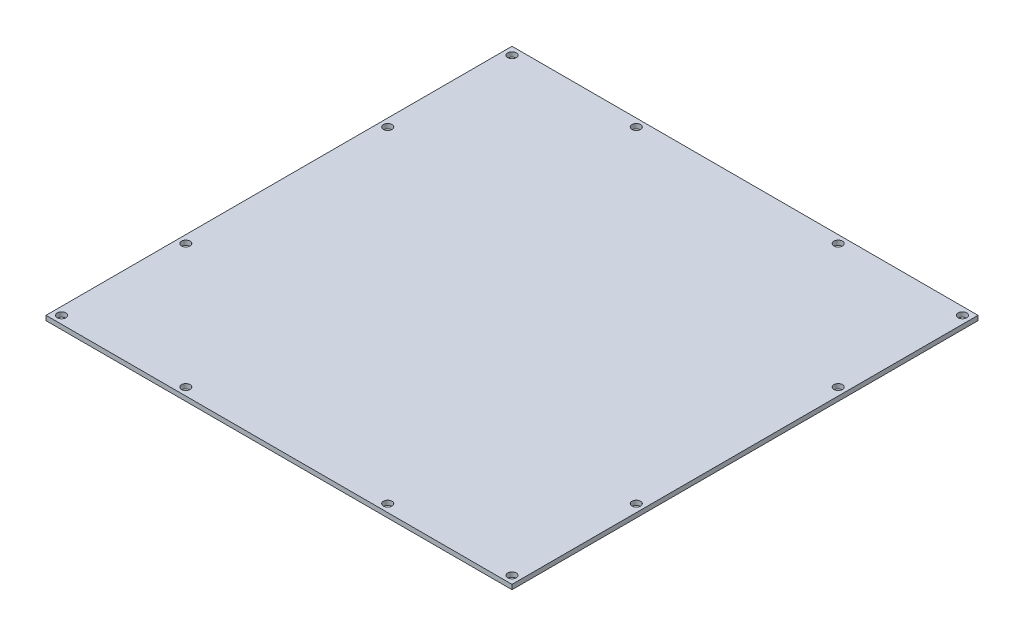
ISO-10303-21;
HEADER;
FILE_DESCRIPTION(('STEP AP214'),'2;1');
FILE_NAME('part.step','',(''),(''),'','','');
FILE_SCHEMA(('AUTOMOTIVE_DESIGN { 1 0 10303 214 1 1 1 1 }'));
ENDSEC;
DATA;
#1=APPLICATION_CONTEXT('core data for automotive mechanical design processes');
#2=APPLICATION_PROTOCOL_DEFINITION('international standard','automotive_design',2000,#1);
#3=PRODUCT_CONTEXT('',#1,'mechanical');
#4=PRODUCT('Part','Part','',(#3));
#5=PRODUCT_RELATED_PRODUCT_CATEGORY('part','',(#4));
#6=PRODUCT_DEFINITION_FORMATION('','',#4);
#7=PRODUCT_DEFINITION_CONTEXT('part definition',#1,'design');
#8=PRODUCT_DEFINITION('design','',#6,#7);
#9=PRODUCT_DEFINITION_SHAPE('','',#8);
#10=(LENGTH_UNIT() NAMED_UNIT(*) SI_UNIT(.MILLI.,.METRE.));
#11=(NAMED_UNIT(*) PLANE_ANGLE_UNIT() SI_UNIT($,.RADIAN.));
#12=(NAMED_UNIT(*) SI_UNIT($,.STERADIAN.) SOLID_ANGLE_UNIT());
#13=UNCERTAINTY_MEASURE_WITH_UNIT(LENGTH_MEASURE(1.E-05),#10,'distance_accuracy_value','');
#14=(GEOMETRIC_REPRESENTATION_CONTEXT(3) GLOBAL_UNCERTAINTY_ASSIGNED_CONTEXT((#13)) GLOBAL_UNIT_ASSIGNED_CONTEXT((#10,
#11,#12)) REPRESENTATION_CONTEXT('',''));
#15=CARTESIAN_POINT('',(0.,0.,0.));
#16=DIRECTION('',(0.,0.,1.));
#17=DIRECTION('',(1.,0.,0.));
#18=AXIS2_PLACEMENT_3D('',#15,#16,#17);
#19=CARTESIAN_POINT('',(150.,3.,-150.));
#20=DIRECTION('',(-1.,0.,0.));
#21=DIRECTION('',(0.,0.,1.));
#22=AXIS2_PLACEMENT_3D('',#19,#20,#21);
#23=PLANE('',#22);
#24=DIRECTION('',(0.,0.,-1.));
#25=VECTOR('',#24,1.);
#26=CARTESIAN_POINT('',(150.,0.,-150.));
#27=LINE('',#26,#25);
#28=CARTESIAN_POINT('',(150.,0.,150.));
#29=VERTEX_POINT('',#28);
#30=CARTESIAN_POINT('',(150.,0.,-150.));
#31=VERTEX_POINT('',#30);
#32=EDGE_CURVE('E106',#29,#31,#27,.T.);
#33=ORIENTED_EDGE('',*,*,#32,.T.);
#34=DIRECTION('',(0.,-1.,0.));
#35=VECTOR('',#34,1.);
#36=CARTESIAN_POINT('',(150.,3.,-150.));
#37=LINE('',#36,#35);
#38=CARTESIAN_POINT('',(150.,3.,-150.));
#39=VERTEX_POINT('',#38);
#40=EDGE_CURVE('E11',#39,#31,#37,.T.);
#41=ORIENTED_EDGE('',*,*,#40,.F.);
#42=DIRECTION('',(0.,0.,-1.));
#43=VECTOR('',#42,1.);
#44=CARTESIAN_POINT('',(150.,3.,-150.));
#45=LINE('',#44,#43);
#46=CARTESIAN_POINT('',(150.,3.,150.));
#47=VERTEX_POINT('',#46);
#48=EDGE_CURVE('E93',#47,#39,#45,.T.);
#49=ORIENTED_EDGE('',*,*,#48,.F.);
#50=DIRECTION('',(0.,-1.,0.));
#51=VECTOR('',#50,1.);
#52=CARTESIAN_POINT('',(150.,3.,150.));
#53=LINE('',#52,#51);
#54=EDGE_CURVE('E102',#47,#29,#53,.T.);
#55=ORIENTED_EDGE('',*,*,#54,.T.);
#56=EDGE_LOOP('',(#33,#41,#49,#55));
#57=FACE_BOUND('',#56,.T.);
#58=ADVANCED_FACE('F40',(#57),#23,.F.);
#59=CARTESIAN_POINT('',(-150.,3.,-150.));
#60=DIRECTION('',(0.,0.,1.));
#61=DIRECTION('',(1.,0.,0.));
#62=AXIS2_PLACEMENT_3D('',#59,#60,#61);
#63=PLANE('',#62);
#64=DIRECTION('',(-1.,0.,0.));
#65=VECTOR('',#64,1.);
#66=CARTESIAN_POINT('',(-150.,0.,-150.));
#67=LINE('',#66,#65);
#68=CARTESIAN_POINT('',(-150.,0.,-150.));
#69=VERTEX_POINT('',#68);
#70=EDGE_CURVE('E97',#31,#69,#67,.T.);
#71=ORIENTED_EDGE('',*,*,#70,.T.);
#72=DIRECTION('',(0.,-1.,0.));
#73=VECTOR('',#72,1.);
#74=CARTESIAN_POINT('',(-150.,3.,-150.));
#75=LINE('',#74,#73);
#76=CARTESIAN_POINT('',(-150.,3.,-150.));
#77=VERTEX_POINT('',#76);
#78=EDGE_CURVE('E49',#77,#69,#75,.T.);
#79=ORIENTED_EDGE('',*,*,#78,.F.);
#80=DIRECTION('',(-1.,0.,0.));
#81=VECTOR('',#80,1.);
#82=CARTESIAN_POINT('',(-150.,3.,-150.));
#83=LINE('',#82,#81);
#84=EDGE_CURVE('E88',#39,#77,#83,.T.);
#85=ORIENTED_EDGE('',*,*,#84,.F.);
#86=ORIENTED_EDGE('',*,*,#40,.T.);
#87=EDGE_LOOP('',(#71,#79,#85,#86));
#88=FACE_BOUND('',#87,.T.);
#89=ADVANCED_FACE('F96',(#88),#63,.F.);
#90=CARTESIAN_POINT('',(-150.,3.,-150.));
#91=DIRECTION('',(1.,0.,0.));
#92=DIRECTION('',(0.,0.,-1.));
#93=AXIS2_PLACEMENT_3D('',#90,#91,#92);
#94=PLANE('',#93);
#95=DIRECTION('',(0.,0.,1.));
#96=VECTOR('',#95,1.);
#97=CARTESIAN_POINT('',(-150.,0.,-150.));
#98=LINE('',#97,#96);
#99=CARTESIAN_POINT('',(-150.,0.,150.));
#100=VERTEX_POINT('',#99);
#101=EDGE_CURVE('E75',#69,#100,#98,.T.);
#102=ORIENTED_EDGE('',*,*,#101,.T.);
#103=DIRECTION('',(0.,-1.,0.));
#104=VECTOR('',#103,1.);
#105=CARTESIAN_POINT('',(-150.,3.,150.));
#106=LINE('',#105,#104);
#107=CARTESIAN_POINT('',(-150.,3.,150.));
#108=VERTEX_POINT('',#107);
#109=EDGE_CURVE('E98',#108,#100,#106,.T.);
#110=ORIENTED_EDGE('',*,*,#109,.F.);
#111=DIRECTION('',(0.,0.,1.));
#112=VECTOR('',#111,1.);
#113=CARTESIAN_POINT('',(-150.,3.,-150.));
#114=LINE('',#113,#112);
#115=EDGE_CURVE('E91',#77,#108,#114,.T.);
#116=ORIENTED_EDGE('',*,*,#115,.F.);
#117=ORIENTED_EDGE('',*,*,#78,.T.);
#118=EDGE_LOOP('',(#102,#110,#116,#117));
#119=FACE_BOUND('',#118,.T.);
#120=ADVANCED_FACE('F100',(#119),#94,.F.);
#121=CARTESIAN_POINT('',(-150.,3.,150.));
#122=DIRECTION('',(0.,0.,-1.));
#123=DIRECTION('',(-1.,0.,0.));
#124=AXIS2_PLACEMENT_3D('',#121,#122,#123);
#125=PLANE('',#124);
#126=DIRECTION('',(1.,0.,0.));
#127=VECTOR('',#126,1.);
#128=CARTESIAN_POINT('',(-150.,0.,150.));
#129=LINE('',#128,#127);
#130=EDGE_CURVE('E81',#100,#29,#129,.T.);
#131=ORIENTED_EDGE('',*,*,#130,.T.);
#132=ORIENTED_EDGE('',*,*,#54,.F.);
#133=DIRECTION('',(1.,0.,0.));
#134=VECTOR('',#133,1.);
#135=CARTESIAN_POINT('',(-150.,3.,150.));
#136=LINE('',#135,#134);
#137=EDGE_CURVE('E58',#108,#47,#136,.T.);
#138=ORIENTED_EDGE('',*,*,#137,.F.);
#139=ORIENTED_EDGE('',*,*,#109,.T.);
#140=EDGE_LOOP('',(#131,#132,#138,#139));
#141=FACE_BOUND('',#140,.T.);
#142=ADVANCED_FACE('F211',(#141),#125,.F.);
#143=CARTESIAN_POINT('',(0.,3.,0.));
#144=DIRECTION('',(0.,1.,0.));
#145=DIRECTION('',(0.,0.,1.));
#146=AXIS2_PLACEMENT_3D('',#143,#144,#145);
#147=PLANE('',#146);
#148=CARTESIAN_POINT('',(-145.,3.,-145.));
#149=DIRECTION('',(0.,1.,0.));
#150=DIRECTION('',(0.,0.,1.));
#151=AXIS2_PLACEMENT_3D('',#148,#149,#150);
#152=CIRCLE('',#151,2.75);
#153=CARTESIAN_POINT('',(-145.,3.,-142.25));
#154=VERTEX_POINT('',#153);
#155=EDGE_CURVE('E149',#154,#154,#152,.T.);
#156=ORIENTED_EDGE('',*,*,#155,.F.);
#157=EDGE_LOOP('',(#156));
#158=FACE_BOUND('',#157,.T.);
#159=CARTESIAN_POINT('',(145.,3.,145.));
#160=DIRECTION('',(0.,1.,0.));
#161=DIRECTION('',(0.,0.,1.));
#162=AXIS2_PLACEMENT_3D('',#159,#160,#161);
#163=CIRCLE('',#162,2.75);
#164=CARTESIAN_POINT('',(145.,3.,147.75));
#165=VERTEX_POINT('',#164);
#166=EDGE_CURVE('E139',#165,#165,#163,.T.);
#167=ORIENTED_EDGE('',*,*,#166,.F.);
#168=EDGE_LOOP('',(#167));
#169=FACE_BOUND('',#168,.T.);
#170=CARTESIAN_POINT('',(-145.,3.,145.));
#171=DIRECTION('',(0.,1.,0.));
#172=DIRECTION('',(0.,0.,1.));
#173=AXIS2_PLACEMENT_3D('',#170,#171,#172);
#174=CIRCLE('',#173,2.75);
#175=CARTESIAN_POINT('',(-145.,3.,147.75));
#176=VERTEX_POINT('',#175);
#177=EDGE_CURVE('E136',#176,#176,#174,.T.);
#178=ORIENTED_EDGE('',*,*,#177,.F.);
#179=EDGE_LOOP('',(#178));
#180=FACE_BOUND('',#179,.T.);
#181=CARTESIAN_POINT('',(145.,3.,-145.));
#182=DIRECTION('',(0.,1.,0.));
#183=DIRECTION('',(0.,0.,1.));
#184=AXIS2_PLACEMENT_3D('',#181,#182,#183);
#185=CIRCLE('',#184,2.75);
#186=CARTESIAN_POINT('',(145.,3.,-142.25));
#187=VERTEX_POINT('',#186);
#188=EDGE_CURVE('E133',#187,#187,#185,.T.);
#189=ORIENTED_EDGE('',*,*,#188,.F.);
#190=EDGE_LOOP('',(#189));
#191=FACE_BOUND('',#190,.T.);
#192=CARTESIAN_POINT('',(-65.,3.,-145.));
#193=DIRECTION('',(0.,1.,0.));
#194=DIRECTION('',(0.,0.,1.));
#195=AXIS2_PLACEMENT_3D('',#192,#193,#194);
#196=CIRCLE('',#195,2.75);
#197=CARTESIAN_POINT('',(-65.,3.,-142.25));
#198=VERTEX_POINT('',#197);
#199=EDGE_CURVE('E132',#198,#198,#196,.T.);
#200=ORIENTED_EDGE('',*,*,#199,.F.);
#201=EDGE_LOOP('',(#200));
#202=FACE_BOUND('',#201,.T.);
#203=CARTESIAN_POINT('',(65.0000000000001,3.,-145.));
#204=DIRECTION('',(0.,1.,0.));
#205=DIRECTION('',(0.,0.,1.));
#206=AXIS2_PLACEMENT_3D('',#203,#204,#205);
#207=CIRCLE('',#206,2.75);
#208=CARTESIAN_POINT('',(65.0000000000001,3.,-142.25));
#209=VERTEX_POINT('',#208);
#210=EDGE_CURVE('E128',#209,#209,#207,.T.);
#211=ORIENTED_EDGE('',*,*,#210,.F.);
#212=EDGE_LOOP('',(#211));
#213=FACE_BOUND('',#212,.T.);
#214=CARTESIAN_POINT('',(65.,3.,145.));
#215=DIRECTION('',(0.,1.,0.));
#216=DIRECTION('',(0.,0.,1.));
#217=AXIS2_PLACEMENT_3D('',#214,#215,#216);
#218=CIRCLE('',#217,2.75);
#219=CARTESIAN_POINT('',(65.,3.,147.75));
#220=VERTEX_POINT('',#219);
#221=EDGE_CURVE('E124',#220,#220,#218,.T.);
#222=ORIENTED_EDGE('',*,*,#221,.F.);
#223=EDGE_LOOP('',(#222));
#224=FACE_BOUND('',#223,.T.);
#225=CARTESIAN_POINT('',(-64.9999999999999,3.,145.));
#226=DIRECTION('',(0.,1.,0.));
#227=DIRECTION('',(0.,0.,1.));
#228=AXIS2_PLACEMENT_3D('',#225,#226,#227);
#229=CIRCLE('',#228,2.75);
#230=CARTESIAN_POINT('',(-64.9999999999999,3.,147.75));
#231=VERTEX_POINT('',#230);
#232=EDGE_CURVE('E123',#231,#231,#229,.T.);
#233=ORIENTED_EDGE('',*,*,#232,.F.);
#234=EDGE_LOOP('',(#233));
#235=FACE_BOUND('',#234,.T.);
#236=CARTESIAN_POINT('',(-145.,3.,-65.));
#237=DIRECTION('',(0.,1.,0.));
#238=DIRECTION('',(0.,0.,1.));
#239=AXIS2_PLACEMENT_3D('',#236,#237,#238);
#240=CIRCLE('',#239,2.75);
#241=CARTESIAN_POINT('',(-145.,3.,-62.25));
#242=VERTEX_POINT('',#241);
#243=EDGE_CURVE('E119',#242,#242,#240,.T.);
#244=ORIENTED_EDGE('',*,*,#243,.F.);
#245=EDGE_LOOP('',(#244));
#246=FACE_BOUND('',#245,.T.);
#247=CARTESIAN_POINT('',(-145.,3.,65.));
#248=DIRECTION('',(0.,1.,0.));
#249=DIRECTION('',(0.,0.,1.));
#250=AXIS2_PLACEMENT_3D('',#247,#248,#249);
#251=CIRCLE('',#250,2.75);
#252=CARTESIAN_POINT('',(-145.,3.,67.75));
#253=VERTEX_POINT('',#252);
#254=EDGE_CURVE('E118',#253,#253,#251,.T.);
#255=ORIENTED_EDGE('',*,*,#254,.F.);
#256=EDGE_LOOP('',(#255));
#257=FACE_BOUND('',#256,.T.);
#258=CARTESIAN_POINT('',(145.,3.,-65.0000000000002));
#259=DIRECTION('',(0.,1.,0.));
#260=DIRECTION('',(0.,0.,1.));
#261=AXIS2_PLACEMENT_3D('',#258,#259,#260);
#262=CIRCLE('',#261,2.75);
#263=CARTESIAN_POINT('',(145.,3.,-62.2500000000002));
#264=VERTEX_POINT('',#263);
#265=EDGE_CURVE('E175',#264,#264,#262,.T.);
#266=ORIENTED_EDGE('',*,*,#265,.F.);
#267=EDGE_LOOP('',(#266));
#268=FACE_BOUND('',#267,.T.);
#269=CARTESIAN_POINT('',(145.,3.,64.9999999999999));
#270=DIRECTION('',(0.,1.,0.));
#271=DIRECTION('',(0.,0.,1.));
#272=AXIS2_PLACEMENT_3D('',#269,#270,#271);
#273=CIRCLE('',#272,2.75);
#274=CARTESIAN_POINT('',(145.,3.,67.7499999999999));
#275=VERTEX_POINT('',#274);
#276=EDGE_CURVE('E181',#275,#275,#273,.T.);
#277=ORIENTED_EDGE('',*,*,#276,.F.);
#278=EDGE_LOOP('',(#277));
#279=FACE_BOUND('',#278,.T.);
#280=ORIENTED_EDGE('',*,*,#48,.T.);
#281=ORIENTED_EDGE('',*,*,#84,.T.);
#282=ORIENTED_EDGE('',*,*,#115,.T.);
#283=ORIENTED_EDGE('',*,*,#137,.T.);
#284=EDGE_LOOP('',(#280,#281,#282,#283));
#285=FACE_BOUND('',#284,.T.);
#286=ADVANCED_FACE('F89',(#158,#169,#180,#191,#202,#213,#224,#235,#246,#257,#268,#279,#285),
#147,.T.);
#287=CARTESIAN_POINT('',(0.,0.,0.));
#288=DIRECTION('',(0.,1.,0.));
#289=DIRECTION('',(0.,0.,1.));
#290=AXIS2_PLACEMENT_3D('',#287,#288,#289);
#291=PLANE('',#290);
#292=CARTESIAN_POINT('',(-145.,0.,-145.));
#293=DIRECTION('',(0.,1.,0.));
#294=DIRECTION('',(0.,0.,1.));
#295=AXIS2_PLACEMENT_3D('',#292,#293,#294);
#296=CIRCLE('',#295,2.75);
#297=CARTESIAN_POINT('',(-145.,0.,-142.25));
#298=VERTEX_POINT('',#297);
#299=EDGE_CURVE('E43',#298,#298,#296,.T.);
#300=ORIENTED_EDGE('',*,*,#299,.T.);
#301=EDGE_LOOP('',(#300));
#302=FACE_BOUND('',#301,.T.);
#303=CARTESIAN_POINT('',(145.,0.,145.));
#304=DIRECTION('',(0.,1.,0.));
#305=DIRECTION('',(0.,0.,1.));
#306=AXIS2_PLACEMENT_3D('',#303,#304,#305);
#307=CIRCLE('',#306,2.75);
#308=CARTESIAN_POINT('',(145.,0.,147.75));
#309=VERTEX_POINT('',#308);
#310=EDGE_CURVE('E137',#309,#309,#307,.T.);
#311=ORIENTED_EDGE('',*,*,#310,.T.);
#312=EDGE_LOOP('',(#311));
#313=FACE_BOUND('',#312,.T.);
#314=CARTESIAN_POINT('',(-145.,0.,145.));
#315=DIRECTION('',(0.,1.,0.));
#316=DIRECTION('',(0.,0.,1.));
#317=AXIS2_PLACEMENT_3D('',#314,#315,#316);
#318=CIRCLE('',#317,2.75);
#319=CARTESIAN_POINT('',(-145.,0.,147.75));
#320=VERTEX_POINT('',#319);
#321=EDGE_CURVE('E134',#320,#320,#318,.T.);
#322=ORIENTED_EDGE('',*,*,#321,.T.);
#323=EDGE_LOOP('',(#322));
#324=FACE_BOUND('',#323,.T.);
#325=CARTESIAN_POINT('',(145.,0.,-145.));
#326=DIRECTION('',(0.,1.,0.));
#327=DIRECTION('',(0.,0.,1.));
#328=AXIS2_PLACEMENT_3D('',#325,#326,#327);
#329=CIRCLE('',#328,2.75);
#330=CARTESIAN_POINT('',(145.,0.,-142.25));
#331=VERTEX_POINT('',#330);
#332=EDGE_CURVE('E129',#331,#331,#329,.T.);
#333=ORIENTED_EDGE('',*,*,#332,.T.);
#334=EDGE_LOOP('',(#333));
#335=FACE_BOUND('',#334,.T.);
#336=CARTESIAN_POINT('',(-65.,0.,-145.));
#337=DIRECTION('',(0.,1.,0.));
#338=DIRECTION('',(0.,0.,1.));
#339=AXIS2_PLACEMENT_3D('',#336,#337,#338);
#340=CIRCLE('',#339,2.75);
#341=CARTESIAN_POINT('',(-65.,0.,-142.25));
#342=VERTEX_POINT('',#341);
#343=EDGE_CURVE('E156',#342,#342,#340,.T.);
#344=ORIENTED_EDGE('',*,*,#343,.T.);
#345=EDGE_LOOP('',(#344));
#346=FACE_BOUND('',#345,.T.);
#347=CARTESIAN_POINT('',(65.0000000000001,0.,-145.));
#348=DIRECTION('',(0.,1.,0.));
#349=DIRECTION('',(0.,0.,1.));
#350=AXIS2_PLACEMENT_3D('',#347,#348,#349);
#351=CIRCLE('',#350,2.75);
#352=CARTESIAN_POINT('',(65.0000000000001,0.,-142.25));
#353=VERTEX_POINT('',#352);
#354=EDGE_CURVE('E125',#353,#353,#351,.T.);
#355=ORIENTED_EDGE('',*,*,#354,.T.);
#356=EDGE_LOOP('',(#355));
#357=FACE_BOUND('',#356,.T.);
#358=CARTESIAN_POINT('',(65.,0.,145.));
#359=DIRECTION('',(0.,1.,0.));
#360=DIRECTION('',(0.,0.,1.));
#361=AXIS2_PLACEMENT_3D('',#358,#359,#360);
#362=CIRCLE('',#361,2.75);
#363=CARTESIAN_POINT('',(65.,0.,147.75));
#364=VERTEX_POINT('',#363);
#365=EDGE_CURVE('E120',#364,#364,#362,.T.);
#366=ORIENTED_EDGE('',*,*,#365,.T.);
#367=EDGE_LOOP('',(#366));
#368=FACE_BOUND('',#367,.T.);
#369=CARTESIAN_POINT('',(-64.9999999999999,0.,145.));
#370=DIRECTION('',(0.,1.,0.));
#371=DIRECTION('',(0.,0.,1.));
#372=AXIS2_PLACEMENT_3D('',#369,#370,#371);
#373=CIRCLE('',#372,2.75);
#374=CARTESIAN_POINT('',(-64.9999999999999,0.,147.75));
#375=VERTEX_POINT('',#374);
#376=EDGE_CURVE('E165',#375,#375,#373,.T.);
#377=ORIENTED_EDGE('',*,*,#376,.T.);
#378=EDGE_LOOP('',(#377));
#379=FACE_BOUND('',#378,.T.);
#380=CARTESIAN_POINT('',(-145.,0.,-65.));
#381=DIRECTION('',(0.,1.,0.));
#382=DIRECTION('',(0.,0.,1.));
#383=AXIS2_PLACEMENT_3D('',#380,#381,#382);
#384=CIRCLE('',#383,2.75);
#385=CARTESIAN_POINT('',(-145.,0.,-62.25));
#386=VERTEX_POINT('',#385);
#387=EDGE_CURVE('E115',#386,#386,#384,.T.);
#388=ORIENTED_EDGE('',*,*,#387,.T.);
#389=EDGE_LOOP('',(#388));
#390=FACE_BOUND('',#389,.T.);
#391=CARTESIAN_POINT('',(-145.,0.,65.));
#392=DIRECTION('',(0.,1.,0.));
#393=DIRECTION('',(0.,0.,1.));
#394=AXIS2_PLACEMENT_3D('',#391,#392,#393);
#395=CIRCLE('',#394,2.75);
#396=CARTESIAN_POINT('',(-145.,0.,67.75));
#397=VERTEX_POINT('',#396);
#398=EDGE_CURVE('E172',#397,#397,#395,.T.);
#399=ORIENTED_EDGE('',*,*,#398,.T.);
#400=EDGE_LOOP('',(#399));
#401=FACE_BOUND('',#400,.T.);
#402=CARTESIAN_POINT('',(145.,0.,-65.0000000000002));
#403=DIRECTION('',(0.,1.,0.));
#404=DIRECTION('',(0.,0.,1.));
#405=AXIS2_PLACEMENT_3D('',#402,#403,#404);
#406=CIRCLE('',#405,2.75);
#407=CARTESIAN_POINT('',(145.,0.,-62.2500000000002));
#408=VERTEX_POINT('',#407);
#409=EDGE_CURVE('E178',#408,#408,#406,.T.);
#410=ORIENTED_EDGE('',*,*,#409,.T.);
#411=EDGE_LOOP('',(#410));
#412=FACE_BOUND('',#411,.T.);
#413=CARTESIAN_POINT('',(145.,0.,64.9999999999999));
#414=DIRECTION('',(0.,1.,0.));
#415=DIRECTION('',(0.,0.,1.));
#416=AXIS2_PLACEMENT_3D('',#413,#414,#415);
#417=CIRCLE('',#416,2.75);
#418=CARTESIAN_POINT('',(145.,0.,67.7499999999999));
#419=VERTEX_POINT('',#418);
#420=EDGE_CURVE('E109',#419,#419,#417,.T.);
#421=ORIENTED_EDGE('',*,*,#420,.T.);
#422=EDGE_LOOP('',(#421));
#423=FACE_BOUND('',#422,.T.);
#424=ORIENTED_EDGE('',*,*,#32,.F.);
#425=ORIENTED_EDGE('',*,*,#130,.F.);
#426=ORIENTED_EDGE('',*,*,#101,.F.);
#427=ORIENTED_EDGE('',*,*,#70,.F.);
#428=EDGE_LOOP('',(#424,#425,#426,#427));
#429=FACE_BOUND('',#428,.T.);
#430=ADVANCED_FACE('F187',(#302,#313,#324,#335,#346,#357,#368,#379,#390,#401,#412,#423,#429),
#291,.F.);
#431=CARTESIAN_POINT('',(145.,3.,64.9999999999999));
#432=DIRECTION('',(0.,1.,0.));
#433=DIRECTION('',(0.,0.,1.));
#434=AXIS2_PLACEMENT_3D('',#431,#432,#433);
#435=CYLINDRICAL_SURFACE('',#434,2.75);
#436=ORIENTED_EDGE('',*,*,#276,.T.);
#437=EDGE_LOOP('',(#436));
#438=FACE_BOUND('',#437,.T.);
#439=ORIENTED_EDGE('',*,*,#420,.F.);
#440=EDGE_LOOP('',(#439));
#441=FACE_BOUND('',#440,.T.);
#442=ADVANCED_FACE('F190',(#438,#441),#435,.F.);
#443=CARTESIAN_POINT('',(145.,3.,-65.0000000000002));
#444=DIRECTION('',(0.,1.,0.));
#445=DIRECTION('',(0.,0.,1.));
#446=AXIS2_PLACEMENT_3D('',#443,#444,#445);
#447=CYLINDRICAL_SURFACE('',#446,2.75);
#448=ORIENTED_EDGE('',*,*,#265,.T.);
#449=EDGE_LOOP('',(#448));
#450=FACE_BOUND('',#449,.T.);
#451=ORIENTED_EDGE('',*,*,#409,.F.);
#452=EDGE_LOOP('',(#451));
#453=FACE_BOUND('',#452,.T.);
#454=ADVANCED_FACE('F192',(#450,#453),#447,.F.);
#455=CARTESIAN_POINT('',(-145.,3.,65.));
#456=DIRECTION('',(0.,1.,0.));
#457=DIRECTION('',(0.,0.,1.));
#458=AXIS2_PLACEMENT_3D('',#455,#456,#457);
#459=CYLINDRICAL_SURFACE('',#458,2.75);
#460=ORIENTED_EDGE('',*,*,#254,.T.);
#461=EDGE_LOOP('',(#460));
#462=FACE_BOUND('',#461,.T.);
#463=ORIENTED_EDGE('',*,*,#398,.F.);
#464=EDGE_LOOP('',(#463));
#465=FACE_BOUND('',#464,.T.);
#466=ADVANCED_FACE('F199',(#462,#465),#459,.F.);
#467=CARTESIAN_POINT('',(-145.,3.,-65.));
#468=DIRECTION('',(0.,1.,0.));
#469=DIRECTION('',(0.,0.,1.));
#470=AXIS2_PLACEMENT_3D('',#467,#468,#469);
#471=CYLINDRICAL_SURFACE('',#470,2.75);
#472=ORIENTED_EDGE('',*,*,#243,.T.);
#473=EDGE_LOOP('',(#472));
#474=FACE_BOUND('',#473,.T.);
#475=ORIENTED_EDGE('',*,*,#387,.F.);
#476=EDGE_LOOP('',(#475));
#477=FACE_BOUND('',#476,.T.);
#478=ADVANCED_FACE('F264',(#474,#477),#471,.F.);
#479=CARTESIAN_POINT('',(-64.9999999999999,3.,145.));
#480=DIRECTION('',(0.,1.,0.));
#481=DIRECTION('',(0.,0.,1.));
#482=AXIS2_PLACEMENT_3D('',#479,#480,#481);
#483=CYLINDRICAL_SURFACE('',#482,2.75);
#484=ORIENTED_EDGE('',*,*,#232,.T.);
#485=EDGE_LOOP('',(#484));
#486=FACE_BOUND('',#485,.T.);
#487=ORIENTED_EDGE('',*,*,#376,.F.);
#488=EDGE_LOOP('',(#487));
#489=FACE_BOUND('',#488,.T.);
#490=ADVANCED_FACE('F273',(#486,#489),#483,.F.);
#491=CARTESIAN_POINT('',(65.,3.,145.));
#492=DIRECTION('',(0.,1.,0.));
#493=DIRECTION('',(0.,0.,1.));
#494=AXIS2_PLACEMENT_3D('',#491,#492,#493);
#495=CYLINDRICAL_SURFACE('',#494,2.75);
#496=ORIENTED_EDGE('',*,*,#221,.T.);
#497=EDGE_LOOP('',(#496));
#498=FACE_BOUND('',#497,.T.);
#499=ORIENTED_EDGE('',*,*,#365,.F.);
#500=EDGE_LOOP('',(#499));
#501=FACE_BOUND('',#500,.T.);
#502=ADVANCED_FACE('F282',(#498,#501),#495,.F.);
#503=CARTESIAN_POINT('',(65.0000000000001,3.,-145.));
#504=DIRECTION('',(0.,1.,0.));
#505=DIRECTION('',(0.,0.,1.));
#506=AXIS2_PLACEMENT_3D('',#503,#504,#505);
#507=CYLINDRICAL_SURFACE('',#506,2.75);
#508=ORIENTED_EDGE('',*,*,#210,.T.);
#509=EDGE_LOOP('',(#508));
#510=FACE_BOUND('',#509,.T.);
#511=ORIENTED_EDGE('',*,*,#354,.F.);
#512=EDGE_LOOP('',(#511));
#513=FACE_BOUND('',#512,.T.);
#514=ADVANCED_FACE('F291',(#510,#513),#507,.F.);
#515=CARTESIAN_POINT('',(-65.,3.,-145.));
#516=DIRECTION('',(0.,1.,0.));
#517=DIRECTION('',(0.,0.,1.));
#518=AXIS2_PLACEMENT_3D('',#515,#516,#517);
#519=CYLINDRICAL_SURFACE('',#518,2.75);
#520=ORIENTED_EDGE('',*,*,#199,.T.);
#521=EDGE_LOOP('',(#520));
#522=FACE_BOUND('',#521,.T.);
#523=ORIENTED_EDGE('',*,*,#343,.F.);
#524=EDGE_LOOP('',(#523));
#525=FACE_BOUND('',#524,.T.);
#526=ADVANCED_FACE('F300',(#522,#525),#519,.F.);
#527=CARTESIAN_POINT('',(145.,3.,-145.));
#528=DIRECTION('',(0.,1.,0.));
#529=DIRECTION('',(0.,0.,1.));
#530=AXIS2_PLACEMENT_3D('',#527,#528,#529);
#531=CYLINDRICAL_SURFACE('',#530,2.75);
#532=ORIENTED_EDGE('',*,*,#188,.T.);
#533=EDGE_LOOP('',(#532));
#534=FACE_BOUND('',#533,.T.);
#535=ORIENTED_EDGE('',*,*,#332,.F.);
#536=EDGE_LOOP('',(#535));
#537=FACE_BOUND('',#536,.T.);
#538=ADVANCED_FACE('F309',(#534,#537),#531,.F.);
#539=CARTESIAN_POINT('',(-145.,3.,145.));
#540=DIRECTION('',(0.,1.,0.));
#541=DIRECTION('',(0.,0.,1.));
#542=AXIS2_PLACEMENT_3D('',#539,#540,#541);
#543=CYLINDRICAL_SURFACE('',#542,2.75);
#544=ORIENTED_EDGE('',*,*,#177,.T.);
#545=EDGE_LOOP('',(#544));
#546=FACE_BOUND('',#545,.T.);
#547=ORIENTED_EDGE('',*,*,#321,.F.);
#548=EDGE_LOOP('',(#547));
#549=FACE_BOUND('',#548,.T.);
#550=ADVANCED_FACE('F318',(#546,#549),#543,.F.);
#551=CARTESIAN_POINT('',(145.,3.,145.));
#552=DIRECTION('',(0.,1.,0.));
#553=DIRECTION('',(0.,0.,1.));
#554=AXIS2_PLACEMENT_3D('',#551,#552,#553);
#555=CYLINDRICAL_SURFACE('',#554,2.75);
#556=ORIENTED_EDGE('',*,*,#166,.T.);
#557=EDGE_LOOP('',(#556));
#558=FACE_BOUND('',#557,.T.);
#559=ORIENTED_EDGE('',*,*,#310,.F.);
#560=EDGE_LOOP('',(#559));
#561=FACE_BOUND('',#560,.T.);
#562=ADVANCED_FACE('F327',(#558,#561),#555,.F.);
#563=CARTESIAN_POINT('',(-145.,3.,-145.));
#564=DIRECTION('',(0.,1.,0.));
#565=DIRECTION('',(0.,0.,1.));
#566=AXIS2_PLACEMENT_3D('',#563,#564,#565);
#567=CYLINDRICAL_SURFACE('',#566,2.75);
#568=ORIENTED_EDGE('',*,*,#155,.T.);
#569=EDGE_LOOP('',(#568));
#570=FACE_BOUND('',#569,.T.);
#571=ORIENTED_EDGE('',*,*,#299,.F.);
#572=EDGE_LOOP('',(#571));
#573=FACE_BOUND('',#572,.T.);
#574=ADVANCED_FACE('F336',(#570,#573),#567,.F.);
#575=CLOSED_SHELL('',(#58,#89,#120,#142,#286,#430,#442,#454,#466,#478,#490,#502,#514,#526,#538,
#550,#562,#574));
#576=MANIFOLD_SOLID_BREP('B2',#575);
#577=ADVANCED_BREP_SHAPE_REPRESENTATION('',(#18,#576),#14);
#578=SHAPE_DEFINITION_REPRESENTATION(#9,#577);
ENDSEC;
END-ISO-10303-21;
